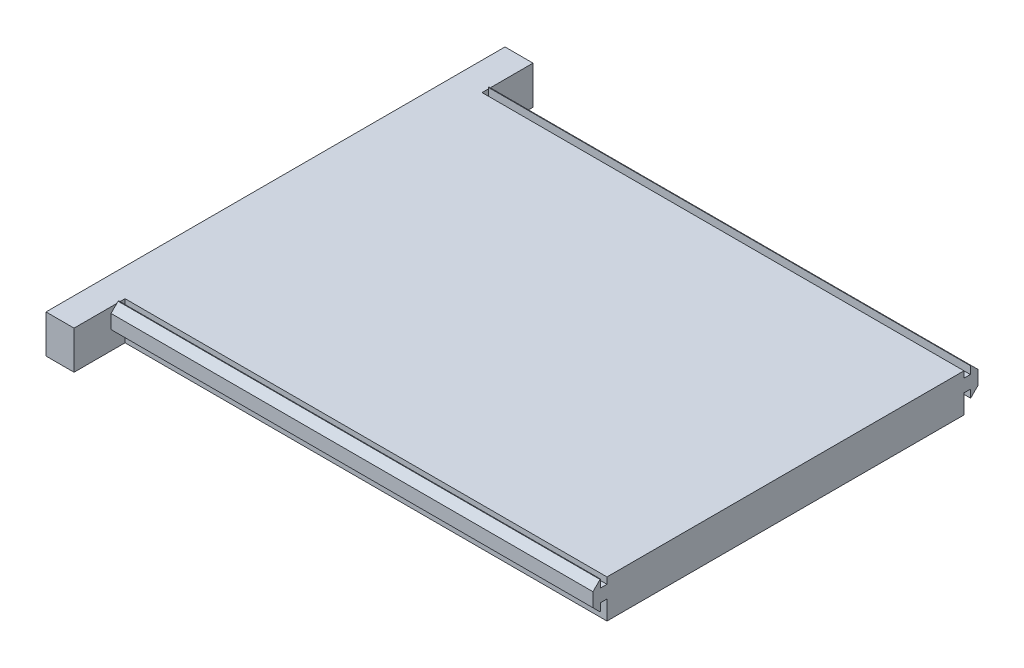
ISO-10303-21;
HEADER;
FILE_DESCRIPTION(('STEP AP214'),'2;1');
FILE_NAME('part.step','',(''),(''),'','','');
FILE_SCHEMA(('AUTOMOTIVE_DESIGN { 1 0 10303 214 1 1 1 1 }'));
ENDSEC;
DATA;
#1=APPLICATION_CONTEXT('core data for automotive mechanical design processes');
#2=APPLICATION_PROTOCOL_DEFINITION('international standard','automotive_design',2000,#1);
#3=PRODUCT_CONTEXT('',#1,'mechanical');
#4=PRODUCT('Part','Part','',(#3));
#5=PRODUCT_RELATED_PRODUCT_CATEGORY('part','',(#4));
#6=PRODUCT_DEFINITION_FORMATION('','',#4);
#7=PRODUCT_DEFINITION_CONTEXT('part definition',#1,'design');
#8=PRODUCT_DEFINITION('design','',#6,#7);
#9=PRODUCT_DEFINITION_SHAPE('','',#8);
#10=(LENGTH_UNIT() NAMED_UNIT(*) SI_UNIT(.MILLI.,.METRE.));
#11=(NAMED_UNIT(*) PLANE_ANGLE_UNIT() SI_UNIT($,.RADIAN.));
#12=(NAMED_UNIT(*) SI_UNIT($,.STERADIAN.) SOLID_ANGLE_UNIT());
#13=UNCERTAINTY_MEASURE_WITH_UNIT(LENGTH_MEASURE(1.E-05),#10,'distance_accuracy_value','');
#14=(GEOMETRIC_REPRESENTATION_CONTEXT(3) GLOBAL_UNCERTAINTY_ASSIGNED_CONTEXT((#13)) GLOBAL_UNIT_ASSIGNED_CONTEXT((#10,
#11,#12)) REPRESENTATION_CONTEXT('',''));
#15=CARTESIAN_POINT('',(0.,0.,0.));
#16=DIRECTION('',(0.,0.,1.));
#17=DIRECTION('',(1.,0.,0.));
#18=AXIS2_PLACEMENT_3D('',#15,#16,#17);
#19=CARTESIAN_POINT('',(265.,0.,0.));
#20=DIRECTION('',(1.,0.,0.));
#21=DIRECTION('',(0.,0.,-1.));
#22=AXIS2_PLACEMENT_3D('',#19,#20,#21);
#23=PLANE('',#22);
#24=DIRECTION('',(0.,0.,1.));
#25=VECTOR('',#24,1.);
#26=CARTESIAN_POINT('',(265.,2.5,0.));
#27=LINE('',#26,#25);
#28=CARTESIAN_POINT('',(265.,2.5,7.5));
#29=VERTEX_POINT('',#28);
#30=CARTESIAN_POINT('',(265.,2.5,10.));
#31=VERTEX_POINT('',#30);
#32=EDGE_CURVE('E267',#29,#31,#27,.T.);
#33=ORIENTED_EDGE('',*,*,#32,.T.);
#34=DIRECTION('',(0.,-1.,0.));
#35=VECTOR('',#34,1.);
#36=CARTESIAN_POINT('',(265.,0.,10.));
#37=LINE('',#36,#35);
#38=CARTESIAN_POINT('',(265.,5.,10.));
#39=VERTEX_POINT('',#38);
#40=EDGE_CURVE('E252',#39,#31,#37,.T.);
#41=ORIENTED_EDGE('',*,*,#40,.F.);
#42=DIRECTION('',(0.,0.,1.));
#43=VECTOR('',#42,1.);
#44=CARTESIAN_POINT('',(265.,5.,0.));
#45=LINE('',#44,#43);
#46=CARTESIAN_POINT('',(265.,5.,150.));
#47=VERTEX_POINT('',#46);
#48=EDGE_CURVE('E440',#39,#47,#45,.T.);
#49=ORIENTED_EDGE('',*,*,#48,.T.);
#50=DIRECTION('',(0.,-1.,0.));
#51=VECTOR('',#50,1.);
#52=CARTESIAN_POINT('',(265.,0.,150.));
#53=LINE('',#52,#51);
#54=CARTESIAN_POINT('',(265.,2.5,150.));
#55=VERTEX_POINT('',#54);
#56=EDGE_CURVE('E437',#47,#55,#53,.T.);
#57=ORIENTED_EDGE('',*,*,#56,.T.);
#58=DIRECTION('',(0.,0.,1.));
#59=VECTOR('',#58,1.);
#60=CARTESIAN_POINT('',(265.,2.5,0.));
#61=LINE('',#60,#59);
#62=CARTESIAN_POINT('',(265.,2.5,152.5));
#63=VERTEX_POINT('',#62);
#64=EDGE_CURVE('E360',#55,#63,#61,.T.);
#65=ORIENTED_EDGE('',*,*,#64,.T.);
#66=DIRECTION('',(0.,1.,0.));
#67=VECTOR('',#66,1.);
#68=CARTESIAN_POINT('',(265.,0.,152.5));
#69=LINE('',#68,#67);
#70=CARTESIAN_POINT('',(265.,5.5,152.5));
#71=VERTEX_POINT('',#70);
#72=EDGE_CURVE('E357',#63,#71,#69,.T.);
#73=ORIENTED_EDGE('',*,*,#72,.T.);
#74=DIRECTION('',(0.,0.,1.));
#75=VECTOR('',#74,1.);
#76=CARTESIAN_POINT('',(265.,5.5,0.));
#77=LINE('',#76,#75);
#78=CARTESIAN_POINT('',(265.,5.5,152.732233047034));
#79=VERTEX_POINT('',#78);
#80=EDGE_CURVE('E354',#71,#79,#77,.T.);
#81=ORIENTED_EDGE('',*,*,#80,.T.);
#82=DIRECTION('',(0.,-0.707106781186549,0.707106781186546));
#83=VECTOR('',#82,1.);
#84=CARTESIAN_POINT('',(265.,79.1161165235168,79.1161165235172));
#85=LINE('',#84,#83);
#86=CARTESIAN_POINT('',(265.,2.73223304703364,155.5));
#87=VERTEX_POINT('',#86);
#88=EDGE_CURVE('E351',#79,#87,#85,.T.);
#89=ORIENTED_EDGE('',*,*,#88,.T.);
#90=DIRECTION('',(0.,-1.,0.));
#91=VECTOR('',#90,1.);
#92=CARTESIAN_POINT('',(265.,0.,155.5));
#93=LINE('',#92,#91);
#94=CARTESIAN_POINT('',(265.,-2.73223304703372,155.5));
#95=VERTEX_POINT('',#94);
#96=EDGE_CURVE('E348',#87,#95,#93,.T.);
#97=ORIENTED_EDGE('',*,*,#96,.T.);
#98=DIRECTION('',(0.,-0.707106781186548,-0.707106781186547));
#99=VECTOR('',#98,1.);
#100=CARTESIAN_POINT('',(265.,-79.1161165235168,79.1161165235169));
#101=LINE('',#100,#99);
#102=CARTESIAN_POINT('',(265.,-5.49999999999996,152.732233047034));
#103=VERTEX_POINT('',#102);
#104=EDGE_CURVE('E345',#95,#103,#101,.T.);
#105=ORIENTED_EDGE('',*,*,#104,.T.);
#106=DIRECTION('',(0.,0.,-1.));
#107=VECTOR('',#106,1.);
#108=CARTESIAN_POINT('',(265.,-5.49999999999999,0.));
#109=LINE('',#108,#107);
#110=CARTESIAN_POINT('',(265.,-5.49999999999999,152.5));
#111=VERTEX_POINT('',#110);
#112=EDGE_CURVE('E342',#103,#111,#109,.T.);
#113=ORIENTED_EDGE('',*,*,#112,.T.);
#114=DIRECTION('',(0.,1.,0.));
#115=VECTOR('',#114,1.);
#116=CARTESIAN_POINT('',(265.,0.,152.5));
#117=LINE('',#116,#115);
#118=CARTESIAN_POINT('',(265.,-2.49999999999999,152.5));
#119=VERTEX_POINT('',#118);
#120=EDGE_CURVE('E339',#111,#119,#117,.T.);
#121=ORIENTED_EDGE('',*,*,#120,.T.);
#122=DIRECTION('',(0.,0.,-1.));
#123=VECTOR('',#122,1.);
#124=CARTESIAN_POINT('',(265.,-2.49999999999999,0.));
#125=LINE('',#124,#123);
#126=CARTESIAN_POINT('',(265.,-2.49999999999999,150.));
#127=VERTEX_POINT('',#126);
#128=EDGE_CURVE('E336',#119,#127,#125,.T.);
#129=ORIENTED_EDGE('',*,*,#128,.T.);
#130=CARTESIAN_POINT('',(265.,-10.,150.));
#131=VERTEX_POINT('',#130);
#132=EDGE_CURVE('E434',#127,#131,#53,.T.);
#133=ORIENTED_EDGE('',*,*,#132,.T.);
#134=DIRECTION('',(0.,0.,-1.));
#135=VECTOR('',#134,1.);
#136=CARTESIAN_POINT('',(265.,-10.,0.));
#137=LINE('',#136,#135);
#138=CARTESIAN_POINT('',(265.,-10.,10.));
#139=VERTEX_POINT('',#138);
#140=EDGE_CURVE('E248',#131,#139,#137,.T.);
#141=ORIENTED_EDGE('',*,*,#140,.T.);
#142=DIRECTION('',(0.,-1.,0.));
#143=VECTOR('',#142,1.);
#144=CARTESIAN_POINT('',(265.,0.,10.));
#145=LINE('',#144,#143);
#146=CARTESIAN_POINT('',(265.,-2.5,10.));
#147=VERTEX_POINT('',#146);
#148=EDGE_CURVE('E241',#147,#139,#145,.T.);
#149=ORIENTED_EDGE('',*,*,#148,.F.);
#150=DIRECTION('',(0.,0.,-1.));
#151=VECTOR('',#150,1.);
#152=CARTESIAN_POINT('',(265.,-2.5,0.));
#153=LINE('',#152,#151);
#154=CARTESIAN_POINT('',(265.,-2.5,7.49999999999999));
#155=VERTEX_POINT('',#154);
#156=EDGE_CURVE('E246',#147,#155,#153,.T.);
#157=ORIENTED_EDGE('',*,*,#156,.T.);
#158=DIRECTION('',(0.,-1.,0.));
#159=VECTOR('',#158,1.);
#160=CARTESIAN_POINT('',(265.,0.,7.49999999999999));
#161=LINE('',#160,#159);
#162=CARTESIAN_POINT('',(265.,-5.5,7.49999999999999));
#163=VERTEX_POINT('',#162);
#164=EDGE_CURVE('E261',#155,#163,#161,.T.);
#165=ORIENTED_EDGE('',*,*,#164,.T.);
#166=DIRECTION('',(0.,0.,-1.));
#167=VECTOR('',#166,1.);
#168=CARTESIAN_POINT('',(265.,-5.5,0.));
#169=LINE('',#168,#167);
#170=CARTESIAN_POINT('',(265.,-5.5,7.26776695296637));
#171=VERTEX_POINT('',#170);
#172=EDGE_CURVE('E293',#163,#171,#169,.T.);
#173=ORIENTED_EDGE('',*,*,#172,.T.);
#174=DIRECTION('',(0.,0.707106781186548,-0.707106781186548));
#175=VECTOR('',#174,1.);
#176=CARTESIAN_POINT('',(265.,0.883883476483188,0.883883476483188));
#177=LINE('',#176,#175);
#178=CARTESIAN_POINT('',(265.,-2.73223304703363,4.5));
#179=VERTEX_POINT('',#178);
#180=EDGE_CURVE('E290',#171,#179,#177,.T.);
#181=ORIENTED_EDGE('',*,*,#180,.T.);
#182=DIRECTION('',(0.,1.,0.));
#183=VECTOR('',#182,1.);
#184=CARTESIAN_POINT('',(265.,0.,4.5));
#185=LINE('',#184,#183);
#186=CARTESIAN_POINT('',(265.,2.73223304703363,4.5));
#187=VERTEX_POINT('',#186);
#188=EDGE_CURVE('E287',#179,#187,#185,.T.);
#189=ORIENTED_EDGE('',*,*,#188,.T.);
#190=DIRECTION('',(0.,0.707106781186548,0.707106781186548));
#191=VECTOR('',#190,1.);
#192=CARTESIAN_POINT('',(265.,-0.883883476483183,0.883883476483183));
#193=LINE('',#192,#191);
#194=CARTESIAN_POINT('',(265.,5.5,7.26776695296636));
#195=VERTEX_POINT('',#194);
#196=EDGE_CURVE('E284',#187,#195,#193,.T.);
#197=ORIENTED_EDGE('',*,*,#196,.T.);
#198=DIRECTION('',(0.,0.,1.));
#199=VECTOR('',#198,1.);
#200=CARTESIAN_POINT('',(265.,5.5,0.));
#201=LINE('',#200,#199);
#202=CARTESIAN_POINT('',(265.,5.5,7.5));
#203=VERTEX_POINT('',#202);
#204=EDGE_CURVE('E281',#195,#203,#201,.T.);
#205=ORIENTED_EDGE('',*,*,#204,.T.);
#206=DIRECTION('',(0.,-1.,0.));
#207=VECTOR('',#206,1.);
#208=CARTESIAN_POINT('',(265.,0.,7.5));
#209=LINE('',#208,#207);
#210=EDGE_CURVE('E270',#203,#29,#209,.T.);
#211=ORIENTED_EDGE('',*,*,#210,.T.);
#212=EDGE_LOOP('',(#33,#41,#49,#57,#65,#73,#81,#89,#97,#105,#113,#121,#129,#133,#141,#149,#157,
#165,#173,#181,#189,#197,#205,#211));
#213=FACE_BOUND('',#212,.T.);
#214=ADVANCED_FACE('F42',(#213),#23,.T.);
#215=CARTESIAN_POINT('',(76.,0.,0.));
#216=DIRECTION('',(-1.,0.,0.));
#217=DIRECTION('',(0.,0.,1.));
#218=AXIS2_PLACEMENT_3D('',#215,#216,#217);
#219=PLANE('',#218);
#220=DIRECTION('',(0.,0.,-1.));
#221=VECTOR('',#220,1.);
#222=CARTESIAN_POINT('',(76.,5.5,0.));
#223=LINE('',#222,#221);
#224=CARTESIAN_POINT('',(76.,5.5,7.5));
#225=VERTEX_POINT('',#224);
#226=CARTESIAN_POINT('',(76.,5.5,7.26776695296636));
#227=VERTEX_POINT('',#226);
#228=EDGE_CURVE('E532',#225,#227,#223,.T.);
#229=ORIENTED_EDGE('',*,*,#228,.T.);
#230=DIRECTION('',(0.,-0.707106781186548,-0.707106781186548));
#231=VECTOR('',#230,1.);
#232=CARTESIAN_POINT('',(76.,-0.883883476483183,0.883883476483183));
#233=LINE('',#232,#231);
#234=CARTESIAN_POINT('',(76.,5.,6.76776695296637));
#235=VERTEX_POINT('',#234);
#236=EDGE_CURVE('E538',#227,#235,#233,.T.);
#237=ORIENTED_EDGE('',*,*,#236,.T.);
#238=DIRECTION('',(0.,0.,1.));
#239=VECTOR('',#238,1.);
#240=CARTESIAN_POINT('',(76.,5.,7.9));
#241=LINE('',#240,#239);
#242=CARTESIAN_POINT('',(76.,5.,7.5));
#243=VERTEX_POINT('',#242);
#244=EDGE_CURVE('E391',#235,#243,#241,.T.);
#245=ORIENTED_EDGE('',*,*,#244,.T.);
#246=DIRECTION('',(0.,1.,0.));
#247=VECTOR('',#246,1.);
#248=CARTESIAN_POINT('',(76.,0.,7.5));
#249=LINE('',#248,#247);
#250=EDGE_CURVE('E11',#243,#225,#249,.T.);
#251=ORIENTED_EDGE('',*,*,#250,.T.);
#252=EDGE_LOOP('',(#229,#237,#245,#251));
#253=FACE_BOUND('',#252,.T.);
#254=ADVANCED_FACE('F568',(#253),#219,.T.);
#255=CARTESIAN_POINT('',(76.,0.,0.));
#256=DIRECTION('',(1.,0.,0.));
#257=DIRECTION('',(0.,0.,-1.));
#258=AXIS2_PLACEMENT_3D('',#255,#256,#257);
#259=PLANE('',#258);
#260=DIRECTION('',(0.,-0.707106781186549,0.707106781186546));
#261=VECTOR('',#260,1.);
#262=CARTESIAN_POINT('',(76.,79.1161165235168,79.1161165235172));
#263=LINE('',#262,#261);
#264=CARTESIAN_POINT('',(76.,5.49999999999998,152.732233047034));
#265=VERTEX_POINT('',#264);
#266=CARTESIAN_POINT('',(76.,5.,153.232233047034));
#267=VERTEX_POINT('',#266);
#268=EDGE_CURVE('E50',#265,#267,#263,.T.);
#269=ORIENTED_EDGE('',*,*,#268,.F.);
#270=DIRECTION('',(0.,0.,-1.));
#271=VECTOR('',#270,1.);
#272=CARTESIAN_POINT('',(76.,5.5,0.));
#273=LINE('',#272,#271);
#274=CARTESIAN_POINT('',(76.,5.5,152.5));
#275=VERTEX_POINT('',#274);
#276=EDGE_CURVE('E327',#265,#275,#273,.T.);
#277=ORIENTED_EDGE('',*,*,#276,.T.);
#278=DIRECTION('',(0.,-1.,0.));
#279=VECTOR('',#278,1.);
#280=CARTESIAN_POINT('',(76.,0.,152.5));
#281=LINE('',#280,#279);
#282=CARTESIAN_POINT('',(76.,5.,152.5));
#283=VERTEX_POINT('',#282);
#284=EDGE_CURVE('E331',#275,#283,#281,.T.);
#285=ORIENTED_EDGE('',*,*,#284,.T.);
#286=DIRECTION('',(0.,0.,1.));
#287=VECTOR('',#286,1.);
#288=CARTESIAN_POINT('',(76.,5.,152.1));
#289=LINE('',#288,#287);
#290=EDGE_CURVE('E387',#283,#267,#289,.T.);
#291=ORIENTED_EDGE('',*,*,#290,.T.);
#292=EDGE_LOOP('',(#269,#277,#285,#291));
#293=FACE_BOUND('',#292,.T.);
#294=ADVANCED_FACE('F466',(#293),#259,.F.);
#295=CARTESIAN_POINT('',(265.,0.,150.));
#296=DIRECTION('',(0.,0.,-1.));
#297=DIRECTION('',(-1.,0.,0.));
#298=AXIS2_PLACEMENT_3D('',#295,#296,#297);
#299=PLANE('',#298);
#300=DIRECTION('',(0.,-1.,0.));
#301=VECTOR('',#300,1.);
#302=CARTESIAN_POINT('',(76.,5.,150.));
#303=LINE('',#302,#301);
#304=CARTESIAN_POINT('',(76.,-2.49999999999999,150.));
#305=VERTEX_POINT('',#304);
#306=CARTESIAN_POINT('',(76.,-10.,150.));
#307=VERTEX_POINT('',#306);
#308=EDGE_CURVE('E417',#305,#307,#303,.T.);
#309=ORIENTED_EDGE('',*,*,#308,.T.);
#310=DIRECTION('',(-1.,0.,0.));
#311=VECTOR('',#310,1.);
#312=CARTESIAN_POINT('',(265.,-10.,150.));
#313=LINE('',#312,#311);
#314=EDGE_CURVE('E451',#131,#307,#313,.T.);
#315=ORIENTED_EDGE('',*,*,#314,.F.);
#316=ORIENTED_EDGE('',*,*,#132,.F.);
#317=DIRECTION('',(1.,0.,0.));
#318=VECTOR('',#317,1.);
#319=CARTESIAN_POINT('',(62.8071989327513,-2.49999999999999,150.));
#320=LINE('',#319,#318);
#321=EDGE_CURVE('E364',#305,#127,#320,.T.);
#322=ORIENTED_EDGE('',*,*,#321,.F.);
#323=EDGE_LOOP('',(#309,#315,#316,#322));
#324=FACE_BOUND('',#323,.T.);
#325=ADVANCED_FACE('F477',(#324),#299,.F.);
#326=CARTESIAN_POINT('',(76.,5.,150.));
#327=VERTEX_POINT('',#326);
#328=CARTESIAN_POINT('',(76.,2.5,150.));
#329=VERTEX_POINT('',#328);
#330=EDGE_CURVE('E414',#327,#329,#303,.T.);
#331=ORIENTED_EDGE('',*,*,#330,.T.);
#332=DIRECTION('',(1.,0.,0.));
#333=VECTOR('',#332,1.);
#334=CARTESIAN_POINT('',(62.8071989327513,2.5,150.));
#335=LINE('',#334,#333);
#336=EDGE_CURVE('E367',#329,#55,#335,.T.);
#337=ORIENTED_EDGE('',*,*,#336,.T.);
#338=ORIENTED_EDGE('',*,*,#56,.F.);
#339=DIRECTION('',(-1.,0.,0.));
#340=VECTOR('',#339,1.);
#341=CARTESIAN_POINT('',(265.,5.,150.));
#342=LINE('',#341,#340);
#343=EDGE_CURVE('E444',#47,#327,#342,.T.);
#344=ORIENTED_EDGE('',*,*,#343,.T.);
#345=EDGE_LOOP('',(#331,#337,#338,#344));
#346=FACE_BOUND('',#345,.T.);
#347=ADVANCED_FACE('F515',(#346),#299,.F.);
#348=CARTESIAN_POINT('',(265.,-10.,0.));
#349=DIRECTION('',(0.,1.,0.));
#350=DIRECTION('',(0.,0.,1.));
#351=AXIS2_PLACEMENT_3D('',#348,#349,#350);
#352=PLANE('',#351);
#353=DIRECTION('',(0.,0.,-1.));
#354=VECTOR('',#353,1.);
#355=CARTESIAN_POINT('',(65.,-10.,0.));
#356=LINE('',#355,#354);
#357=CARTESIAN_POINT('',(65.,-10.,170.));
#358=VERTEX_POINT('',#357);
#359=CARTESIAN_POINT('',(65.,-10.,-10.));
#360=VERTEX_POINT('',#359);
#361=EDGE_CURVE('E431',#358,#360,#356,.T.);
#362=ORIENTED_EDGE('',*,*,#361,.T.);
#363=DIRECTION('',(-1.,0.,0.));
#364=VECTOR('',#363,1.);
#365=CARTESIAN_POINT('',(76.,-10.,-10.));
#366=LINE('',#365,#364);
#367=CARTESIAN_POINT('',(76.,-10.,-10.));
#368=VERTEX_POINT('',#367);
#369=EDGE_CURVE('E390',#368,#360,#366,.T.);
#370=ORIENTED_EDGE('',*,*,#369,.F.);
#371=DIRECTION('',(0.,0.,1.));
#372=VECTOR('',#371,1.);
#373=CARTESIAN_POINT('',(76.,-10.,10.));
#374=LINE('',#373,#372);
#375=CARTESIAN_POINT('',(76.,-10.,10.));
#376=VERTEX_POINT('',#375);
#377=EDGE_CURVE('E397',#368,#376,#374,.T.);
#378=ORIENTED_EDGE('',*,*,#377,.T.);
#379=DIRECTION('',(-1.,0.,0.));
#380=VECTOR('',#379,1.);
#381=CARTESIAN_POINT('',(265.,-10.,10.));
#382=LINE('',#381,#380);
#383=EDGE_CURVE('E449',#139,#376,#382,.T.);
#384=ORIENTED_EDGE('',*,*,#383,.F.);
#385=ORIENTED_EDGE('',*,*,#140,.F.);
#386=ORIENTED_EDGE('',*,*,#314,.T.);
#387=DIRECTION('',(0.,0.,1.));
#388=VECTOR('',#387,1.);
#389=CARTESIAN_POINT('',(76.,-10.,150.));
#390=LINE('',#389,#388);
#391=CARTESIAN_POINT('',(76.,-10.,170.));
#392=VERTEX_POINT('',#391);
#393=EDGE_CURVE('E416',#307,#392,#390,.T.);
#394=ORIENTED_EDGE('',*,*,#393,.T.);
#395=DIRECTION('',(-1.,0.,0.));
#396=VECTOR('',#395,1.);
#397=CARTESIAN_POINT('',(76.,-10.,170.));
#398=LINE('',#397,#396);
#399=EDGE_CURVE('E425',#392,#358,#398,.T.);
#400=ORIENTED_EDGE('',*,*,#399,.T.);
#401=EDGE_LOOP('',(#362,#370,#378,#384,#385,#386,#394,#400));
#402=FACE_BOUND('',#401,.T.);
#403=ADVANCED_FACE('F44',(#402),#352,.F.);
#404=CARTESIAN_POINT('',(265.,0.,10.));
#405=DIRECTION('',(0.,0.,-1.));
#406=DIRECTION('',(-1.,0.,0.));
#407=AXIS2_PLACEMENT_3D('',#404,#405,#406);
#408=PLANE('',#407);
#409=DIRECTION('',(0.,1.,0.));
#410=VECTOR('',#409,1.);
#411=CARTESIAN_POINT('',(76.,5.,10.));
#412=LINE('',#411,#410);
#413=CARTESIAN_POINT('',(76.,-2.5,10.));
#414=VERTEX_POINT('',#413);
#415=EDGE_CURVE('E257',#376,#414,#412,.T.);
#416=ORIENTED_EDGE('',*,*,#415,.T.);
#417=DIRECTION('',(1.,0.,0.));
#418=VECTOR('',#417,1.);
#419=CARTESIAN_POINT('',(62.8071989327513,-2.5,10.));
#420=LINE('',#419,#418);
#421=EDGE_CURVE('E255',#414,#147,#420,.T.);
#422=ORIENTED_EDGE('',*,*,#421,.T.);
#423=ORIENTED_EDGE('',*,*,#148,.T.);
#424=ORIENTED_EDGE('',*,*,#383,.T.);
#425=EDGE_LOOP('',(#416,#422,#423,#424));
#426=FACE_BOUND('',#425,.T.);
#427=ADVANCED_FACE('F256',(#426),#408,.T.);
#428=CARTESIAN_POINT('',(265.,0.,10.));
#429=DIRECTION('',(0.,0.,-1.));
#430=DIRECTION('',(-1.,0.,0.));
#431=AXIS2_PLACEMENT_3D('',#428,#429,#430);
#432=PLANE('',#431);
#433=CARTESIAN_POINT('',(76.,2.5,10.));
#434=VERTEX_POINT('',#433);
#435=CARTESIAN_POINT('',(76.,5.,10.));
#436=VERTEX_POINT('',#435);
#437=EDGE_CURVE('E412',#434,#436,#412,.T.);
#438=ORIENTED_EDGE('',*,*,#437,.T.);
#439=DIRECTION('',(-1.,0.,0.));
#440=VECTOR('',#439,1.);
#441=CARTESIAN_POINT('',(265.,5.,10.));
#442=LINE('',#441,#440);
#443=EDGE_CURVE('E446',#39,#436,#442,.T.);
#444=ORIENTED_EDGE('',*,*,#443,.F.);
#445=ORIENTED_EDGE('',*,*,#40,.T.);
#446=DIRECTION('',(1.,0.,0.));
#447=VECTOR('',#446,1.);
#448=CARTESIAN_POINT('',(62.8071989327513,2.5,10.));
#449=LINE('',#448,#447);
#450=EDGE_CURVE('E260',#434,#31,#449,.T.);
#451=ORIENTED_EDGE('',*,*,#450,.F.);
#452=EDGE_LOOP('',(#438,#444,#445,#451));
#453=FACE_BOUND('',#452,.T.);
#454=ADVANCED_FACE('F522',(#453),#432,.T.);
#455=CARTESIAN_POINT('',(265.,5.,0.));
#456=DIRECTION('',(0.,-1.,0.));
#457=DIRECTION('',(0.,0.,-1.));
#458=AXIS2_PLACEMENT_3D('',#455,#456,#457);
#459=PLANE('',#458);
#460=DIRECTION('',(0.,0.,1.));
#461=VECTOR('',#460,1.);
#462=CARTESIAN_POINT('',(65.,5.,0.));
#463=LINE('',#462,#461);
#464=CARTESIAN_POINT('',(65.,5.,-10.));
#465=VERTEX_POINT('',#464);
#466=CARTESIAN_POINT('',(65.,5.,170.));
#467=VERTEX_POINT('',#466);
#468=EDGE_CURVE('E436',#465,#467,#463,.T.);
#469=ORIENTED_EDGE('',*,*,#468,.T.);
#470=DIRECTION('',(-1.,0.,0.));
#471=VECTOR('',#470,1.);
#472=CARTESIAN_POINT('',(76.,5.,170.));
#473=LINE('',#472,#471);
#474=CARTESIAN_POINT('',(76.,5.,170.));
#475=VERTEX_POINT('',#474);
#476=EDGE_CURVE('E428',#475,#467,#473,.T.);
#477=ORIENTED_EDGE('',*,*,#476,.F.);
#478=DIRECTION('',(0.,0.,-1.));
#479=VECTOR('',#478,1.);
#480=CARTESIAN_POINT('',(76.,5.,150.));
#481=LINE('',#480,#479);
#482=EDGE_CURVE('E423',#475,#267,#481,.T.);
#483=ORIENTED_EDGE('',*,*,#482,.T.);
#484=ORIENTED_EDGE('',*,*,#290,.F.);
#485=EDGE_CURVE('E65',#283,#327,#481,.T.);
#486=ORIENTED_EDGE('',*,*,#485,.T.);
#487=ORIENTED_EDGE('',*,*,#343,.F.);
#488=ORIENTED_EDGE('',*,*,#48,.F.);
#489=ORIENTED_EDGE('',*,*,#443,.T.);
#490=DIRECTION('',(0.,0.,-1.));
#491=VECTOR('',#490,1.);
#492=CARTESIAN_POINT('',(76.,5.,10.));
#493=LINE('',#492,#491);
#494=EDGE_CURVE('E410',#436,#243,#493,.T.);
#495=ORIENTED_EDGE('',*,*,#494,.T.);
#496=ORIENTED_EDGE('',*,*,#244,.F.);
#497=CARTESIAN_POINT('',(76.,5.,-10.));
#498=VERTEX_POINT('',#497);
#499=EDGE_CURVE('E409',#235,#498,#493,.T.);
#500=ORIENTED_EDGE('',*,*,#499,.T.);
#501=DIRECTION('',(-1.,0.,0.));
#502=VECTOR('',#501,1.);
#503=CARTESIAN_POINT('',(76.,5.,-10.));
#504=LINE('',#503,#502);
#505=EDGE_CURVE('E394',#498,#465,#504,.T.);
#506=ORIENTED_EDGE('',*,*,#505,.T.);
#507=EDGE_LOOP('',(#469,#477,#483,#484,#486,#487,#488,#489,#495,#496,#500,#506));
#508=FACE_BOUND('',#507,.T.);
#509=ADVANCED_FACE('F468',(#508),#459,.F.);
#510=CARTESIAN_POINT('',(65.,0.,0.));
#511=DIRECTION('',(1.,0.,0.));
#512=DIRECTION('',(0.,0.,-1.));
#513=AXIS2_PLACEMENT_3D('',#510,#511,#512);
#514=PLANE('',#513);
#515=DIRECTION('',(0.,1.,0.));
#516=VECTOR('',#515,1.);
#517=CARTESIAN_POINT('',(65.,5.,170.));
#518=LINE('',#517,#516);
#519=EDGE_CURVE('E403',#358,#467,#518,.T.);
#520=ORIENTED_EDGE('',*,*,#519,.T.);
#521=ORIENTED_EDGE('',*,*,#468,.F.);
#522=DIRECTION('',(0.,-1.,0.));
#523=VECTOR('',#522,1.);
#524=CARTESIAN_POINT('',(65.,5.,-10.));
#525=LINE('',#524,#523);
#526=EDGE_CURVE('E400',#465,#360,#525,.T.);
#527=ORIENTED_EDGE('',*,*,#526,.T.);
#528=ORIENTED_EDGE('',*,*,#361,.F.);
#529=EDGE_LOOP('',(#520,#521,#527,#528));
#530=FACE_BOUND('',#529,.T.);
#531=ADVANCED_FACE('F588',(#530),#514,.F.);
#532=CARTESIAN_POINT('',(76.,0.,0.));
#533=DIRECTION('',(-1.,0.,0.));
#534=DIRECTION('',(0.,0.,1.));
#535=AXIS2_PLACEMENT_3D('',#532,#533,#534);
#536=PLANE('',#535);
#537=DIRECTION('',(0.,0.,-1.));
#538=VECTOR('',#537,1.);
#539=CARTESIAN_POINT('',(76.,2.5,0.));
#540=LINE('',#539,#538);
#541=CARTESIAN_POINT('',(76.,2.5,152.5));
#542=VERTEX_POINT('',#541);
#543=EDGE_CURVE('E273',#542,#329,#540,.T.);
#544=ORIENTED_EDGE('',*,*,#543,.T.);
#545=ORIENTED_EDGE('',*,*,#330,.F.);
#546=ORIENTED_EDGE('',*,*,#485,.F.);
#547=EDGE_CURVE('E330',#283,#542,#281,.T.);
#548=ORIENTED_EDGE('',*,*,#547,.T.);
#549=EDGE_LOOP('',(#544,#545,#546,#548));
#550=FACE_BOUND('',#549,.T.);
#551=ADVANCED_FACE('F508',(#550),#536,.F.);
#552=DIRECTION('',(0.,0.707106781186549,-0.707106781186546));
#553=VECTOR('',#552,1.);
#554=CARTESIAN_POINT('',(76.,79.1161165235168,79.1161165235172));
#555=LINE('',#554,#553);
#556=CARTESIAN_POINT('',(76.,2.73223304703364,155.5));
#557=VERTEX_POINT('',#556);
#558=EDGE_CURVE('E324',#557,#267,#555,.T.);
#559=ORIENTED_EDGE('',*,*,#558,.T.);
#560=ORIENTED_EDGE('',*,*,#482,.F.);
#561=DIRECTION('',(0.,1.,0.));
#562=VECTOR('',#561,1.);
#563=CARTESIAN_POINT('',(76.,5.,170.));
#564=LINE('',#563,#562);
#565=EDGE_CURVE('E420',#392,#475,#564,.T.);
#566=ORIENTED_EDGE('',*,*,#565,.F.);
#567=ORIENTED_EDGE('',*,*,#393,.F.);
#568=ORIENTED_EDGE('',*,*,#308,.F.);
#569=DIRECTION('',(0.,0.,1.));
#570=VECTOR('',#569,1.);
#571=CARTESIAN_POINT('',(76.,-2.49999999999999,0.));
#572=LINE('',#571,#570);
#573=CARTESIAN_POINT('',(76.,-2.49999999999999,152.5));
#574=VERTEX_POINT('',#573);
#575=EDGE_CURVE('E268',#305,#574,#572,.T.);
#576=ORIENTED_EDGE('',*,*,#575,.T.);
#577=DIRECTION('',(0.,-1.,0.));
#578=VECTOR('',#577,1.);
#579=CARTESIAN_POINT('',(76.,0.,152.5));
#580=LINE('',#579,#578);
#581=CARTESIAN_POINT('',(76.,-5.49999999999999,152.5));
#582=VERTEX_POINT('',#581);
#583=EDGE_CURVE('E318',#574,#582,#580,.T.);
#584=ORIENTED_EDGE('',*,*,#583,.T.);
#585=DIRECTION('',(0.,0.,1.));
#586=VECTOR('',#585,1.);
#587=CARTESIAN_POINT('',(76.,-5.49999999999999,0.));
#588=LINE('',#587,#586);
#589=CARTESIAN_POINT('',(76.,-5.49999999999999,152.732233047034));
#590=VERTEX_POINT('',#589);
#591=EDGE_CURVE('E314',#582,#590,#588,.T.);
#592=ORIENTED_EDGE('',*,*,#591,.T.);
#593=DIRECTION('',(0.,0.707106781186548,0.707106781186547));
#594=VECTOR('',#593,1.);
#595=CARTESIAN_POINT('',(76.,-79.1161165235168,79.1161165235169));
#596=LINE('',#595,#594);
#597=CARTESIAN_POINT('',(76.,-2.73223304703372,155.5));
#598=VERTEX_POINT('',#597);
#599=EDGE_CURVE('E317',#590,#598,#596,.T.);
#600=ORIENTED_EDGE('',*,*,#599,.T.);
#601=DIRECTION('',(0.,1.,0.));
#602=VECTOR('',#601,1.);
#603=CARTESIAN_POINT('',(76.,0.,155.5));
#604=LINE('',#603,#602);
#605=EDGE_CURVE('E321',#598,#557,#604,.T.);
#606=ORIENTED_EDGE('',*,*,#605,.T.);
#607=EDGE_LOOP('',(#559,#560,#566,#567,#568,#576,#584,#592,#600,#606));
#608=FACE_BOUND('',#607,.T.);
#609=ADVANCED_FACE('F463',(#608),#536,.F.);
#610=CARTESIAN_POINT('',(76.,5.,170.));
#611=DIRECTION('',(0.,0.,1.));
#612=DIRECTION('',(1.,0.,0.));
#613=AXIS2_PLACEMENT_3D('',#610,#611,#612);
#614=PLANE('',#613);
#615=ORIENTED_EDGE('',*,*,#519,.F.);
#616=ORIENTED_EDGE('',*,*,#399,.F.);
#617=ORIENTED_EDGE('',*,*,#565,.T.);
#618=ORIENTED_EDGE('',*,*,#476,.T.);
#619=EDGE_LOOP('',(#615,#616,#617,#618));
#620=FACE_BOUND('',#619,.T.);
#621=ADVANCED_FACE('F472',(#620),#614,.T.);
#622=CARTESIAN_POINT('',(76.,5.,-10.));
#623=DIRECTION('',(0.,0.,-1.));
#624=DIRECTION('',(0.,1.,0.));
#625=AXIS2_PLACEMENT_3D('',#622,#623,#624);
#626=PLANE('',#625);
#627=ORIENTED_EDGE('',*,*,#526,.F.);
#628=ORIENTED_EDGE('',*,*,#505,.F.);
#629=DIRECTION('',(0.,-1.,0.));
#630=VECTOR('',#629,1.);
#631=CARTESIAN_POINT('',(76.,5.,-10.));
#632=LINE('',#631,#630);
#633=EDGE_CURVE('E406',#498,#368,#632,.T.);
#634=ORIENTED_EDGE('',*,*,#633,.T.);
#635=ORIENTED_EDGE('',*,*,#369,.T.);
#636=EDGE_LOOP('',(#627,#628,#634,#635));
#637=FACE_BOUND('',#636,.T.);
#638=ADVANCED_FACE('F558',(#637),#626,.T.);
#639=CARTESIAN_POINT('',(76.,0.,0.));
#640=DIRECTION('',(1.,0.,0.));
#641=DIRECTION('',(0.,0.,-1.));
#642=AXIS2_PLACEMENT_3D('',#639,#640,#641);
#643=PLANE('',#642);
#644=ORIENTED_EDGE('',*,*,#499,.F.);
#645=CARTESIAN_POINT('',(76.,2.73223304703363,4.5));
#646=VERTEX_POINT('',#645);
#647=EDGE_CURVE('E537',#235,#646,#233,.T.);
#648=ORIENTED_EDGE('',*,*,#647,.T.);
#649=DIRECTION('',(0.,-1.,0.));
#650=VECTOR('',#649,1.);
#651=CARTESIAN_POINT('',(76.,0.,4.5));
#652=LINE('',#651,#650);
#653=CARTESIAN_POINT('',(76.,-2.73223304703363,4.5));
#654=VERTEX_POINT('',#653);
#655=EDGE_CURVE('E541',#646,#654,#652,.T.);
#656=ORIENTED_EDGE('',*,*,#655,.T.);
#657=DIRECTION('',(0.,-0.707106781186548,0.707106781186548));
#658=VECTOR('',#657,1.);
#659=CARTESIAN_POINT('',(76.,0.883883476483188,0.883883476483188));
#660=LINE('',#659,#658);
#661=CARTESIAN_POINT('',(76.,-5.5,7.26776695296637));
#662=VERTEX_POINT('',#661);
#663=EDGE_CURVE('E544',#654,#662,#660,.T.);
#664=ORIENTED_EDGE('',*,*,#663,.T.);
#665=DIRECTION('',(0.,0.,1.));
#666=VECTOR('',#665,1.);
#667=CARTESIAN_POINT('',(76.,-5.5,0.));
#668=LINE('',#667,#666);
#669=CARTESIAN_POINT('',(76.,-5.5,7.49999999999999));
#670=VERTEX_POINT('',#669);
#671=EDGE_CURVE('E547',#662,#670,#668,.T.);
#672=ORIENTED_EDGE('',*,*,#671,.T.);
#673=DIRECTION('',(0.,1.,0.));
#674=VECTOR('',#673,1.);
#675=CARTESIAN_POINT('',(76.,0.,7.49999999999999));
#676=LINE('',#675,#674);
#677=CARTESIAN_POINT('',(76.,-2.5,7.49999999999999));
#678=VERTEX_POINT('',#677);
#679=EDGE_CURVE('E549',#670,#678,#676,.T.);
#680=ORIENTED_EDGE('',*,*,#679,.T.);
#681=DIRECTION('',(0.,0.,1.));
#682=VECTOR('',#681,1.);
#683=CARTESIAN_POINT('',(76.,-2.5,0.));
#684=LINE('',#683,#682);
#685=EDGE_CURVE('E276',#678,#414,#684,.T.);
#686=ORIENTED_EDGE('',*,*,#685,.T.);
#687=ORIENTED_EDGE('',*,*,#415,.F.);
#688=ORIENTED_EDGE('',*,*,#377,.F.);
#689=ORIENTED_EDGE('',*,*,#633,.F.);
#690=EDGE_LOOP('',(#644,#648,#656,#664,#672,#680,#686,#687,#688,#689));
#691=FACE_BOUND('',#690,.T.);
#692=ADVANCED_FACE('F552',(#691),#643,.T.);
#693=ORIENTED_EDGE('',*,*,#437,.F.);
#694=DIRECTION('',(0.,0.,-1.));
#695=VECTOR('',#694,1.);
#696=CARTESIAN_POINT('',(76.,2.5,0.));
#697=LINE('',#696,#695);
#698=CARTESIAN_POINT('',(76.,2.5,7.5));
#699=VERTEX_POINT('',#698);
#700=EDGE_CURVE('E298',#434,#699,#697,.T.);
#701=ORIENTED_EDGE('',*,*,#700,.T.);
#702=DIRECTION('',(0.,1.,0.));
#703=VECTOR('',#702,1.);
#704=CARTESIAN_POINT('',(76.,0.,7.5));
#705=LINE('',#704,#703);
#706=EDGE_CURVE('E530',#699,#243,#705,.T.);
#707=ORIENTED_EDGE('',*,*,#706,.T.);
#708=ORIENTED_EDGE('',*,*,#494,.F.);
#709=EDGE_LOOP('',(#693,#701,#707,#708));
#710=FACE_BOUND('',#709,.T.);
#711=ADVANCED_FACE('F570',(#710),#643,.T.);
#712=CARTESIAN_POINT('',(62.8071989327513,0.,152.5));
#713=DIRECTION('',(0.,0.,-1.));
#714=DIRECTION('',(-1.,0.,0.));
#715=AXIS2_PLACEMENT_3D('',#712,#713,#714);
#716=PLANE('',#715);
#717=DIRECTION('',(1.,0.,0.));
#718=VECTOR('',#717,1.);
#719=CARTESIAN_POINT('',(62.8071989327513,-2.49999999999999,152.5));
#720=LINE('',#719,#718);
#721=EDGE_CURVE('E363',#574,#119,#720,.T.);
#722=ORIENTED_EDGE('',*,*,#721,.T.);
#723=ORIENTED_EDGE('',*,*,#120,.F.);
#724=DIRECTION('',(1.,0.,0.));
#725=VECTOR('',#724,1.);
#726=CARTESIAN_POINT('',(62.8071989327513,-5.49999999999999,152.5));
#727=LINE('',#726,#725);
#728=EDGE_CURVE('E382',#582,#111,#727,.T.);
#729=ORIENTED_EDGE('',*,*,#728,.F.);
#730=ORIENTED_EDGE('',*,*,#583,.F.);
#731=EDGE_LOOP('',(#722,#723,#729,#730));
#732=FACE_BOUND('',#731,.T.);
#733=ADVANCED_FACE('F486',(#732),#716,.T.);
#734=CARTESIAN_POINT('',(62.8071989327513,-5.49999999999999,0.));
#735=DIRECTION('',(0.,-1.,0.));
#736=DIRECTION('',(0.,0.,-1.));
#737=AXIS2_PLACEMENT_3D('',#734,#735,#736);
#738=PLANE('',#737);
#739=ORIENTED_EDGE('',*,*,#728,.T.);
#740=ORIENTED_EDGE('',*,*,#112,.F.);
#741=DIRECTION('',(1.,0.,0.));
#742=VECTOR('',#741,1.);
#743=CARTESIAN_POINT('',(62.8071989327513,-5.49999999999996,152.732233047034));
#744=LINE('',#743,#742);
#745=EDGE_CURVE('E380',#590,#103,#744,.T.);
#746=ORIENTED_EDGE('',*,*,#745,.F.);
#747=ORIENTED_EDGE('',*,*,#591,.F.);
#748=EDGE_LOOP('',(#739,#740,#746,#747));
#749=FACE_BOUND('',#748,.T.);
#750=ADVANCED_FACE('F490',(#749),#738,.T.);
#751=CARTESIAN_POINT('',(62.8071989327513,-79.1161165235168,79.1161165235169));
#752=DIRECTION('',(0.,-0.707106781186547,0.707106781186548));
#753=DIRECTION('',(0.,-0.707106781186548,-0.707106781186547));
#754=AXIS2_PLACEMENT_3D('',#751,#752,#753);
#755=PLANE('',#754);
#756=ORIENTED_EDGE('',*,*,#745,.T.);
#757=ORIENTED_EDGE('',*,*,#104,.F.);
#758=DIRECTION('',(1.,0.,0.));
#759=VECTOR('',#758,1.);
#760=CARTESIAN_POINT('',(62.8071989327513,-2.73223304703372,155.5));
#761=LINE('',#760,#759);
#762=EDGE_CURVE('E378',#598,#95,#761,.T.);
#763=ORIENTED_EDGE('',*,*,#762,.F.);
#764=ORIENTED_EDGE('',*,*,#599,.F.);
#765=EDGE_LOOP('',(#756,#757,#763,#764));
#766=FACE_BOUND('',#765,.T.);
#767=ADVANCED_FACE('F494',(#766),#755,.T.);
#768=CARTESIAN_POINT('',(62.8071989327513,0.,155.5));
#769=DIRECTION('',(0.,0.,1.));
#770=DIRECTION('',(1.,0.,0.));
#771=AXIS2_PLACEMENT_3D('',#768,#769,#770);
#772=PLANE('',#771);
#773=ORIENTED_EDGE('',*,*,#762,.T.);
#774=ORIENTED_EDGE('',*,*,#96,.F.);
#775=DIRECTION('',(1.,0.,0.));
#776=VECTOR('',#775,1.);
#777=CARTESIAN_POINT('',(62.8071989327513,2.73223304703364,155.5));
#778=LINE('',#777,#776);
#779=EDGE_CURVE('E376',#557,#87,#778,.T.);
#780=ORIENTED_EDGE('',*,*,#779,.F.);
#781=ORIENTED_EDGE('',*,*,#605,.F.);
#782=EDGE_LOOP('',(#773,#774,#780,#781));
#783=FACE_BOUND('',#782,.T.);
#784=ADVANCED_FACE('F498',(#783),#772,.T.);
#785=CARTESIAN_POINT('',(62.8071989327513,79.1161165235168,79.1161165235172));
#786=DIRECTION('',(0.,0.707106781186546,0.707106781186549));
#787=DIRECTION('',(0.,-0.707106781186549,0.707106781186546));
#788=AXIS2_PLACEMENT_3D('',#785,#786,#787);
#789=PLANE('',#788);
#790=ORIENTED_EDGE('',*,*,#779,.T.);
#791=ORIENTED_EDGE('',*,*,#88,.F.);
#792=DIRECTION('',(1.,0.,0.));
#793=VECTOR('',#792,1.);
#794=CARTESIAN_POINT('',(62.8071989327513,5.5,152.732233047034));
#795=LINE('',#794,#793);
#796=EDGE_CURVE('E374',#265,#79,#795,.T.);
#797=ORIENTED_EDGE('',*,*,#796,.F.);
#798=ORIENTED_EDGE('',*,*,#268,.T.);
#799=ORIENTED_EDGE('',*,*,#558,.F.);
#800=EDGE_LOOP('',(#790,#791,#797,#798,#799));
#801=FACE_BOUND('',#800,.T.);
#802=ADVANCED_FACE('F457',(#801),#789,.T.);
#803=CARTESIAN_POINT('',(62.8071989327513,5.5,0.));
#804=DIRECTION('',(0.,1.,0.));
#805=DIRECTION('',(0.,0.,1.));
#806=AXIS2_PLACEMENT_3D('',#803,#804,#805);
#807=PLANE('',#806);
#808=ORIENTED_EDGE('',*,*,#796,.T.);
#809=ORIENTED_EDGE('',*,*,#80,.F.);
#810=DIRECTION('',(1.,0.,0.));
#811=VECTOR('',#810,1.);
#812=CARTESIAN_POINT('',(62.8071989327513,5.5,152.5));
#813=LINE('',#812,#811);
#814=EDGE_CURVE('E372',#275,#71,#813,.T.);
#815=ORIENTED_EDGE('',*,*,#814,.F.);
#816=ORIENTED_EDGE('',*,*,#276,.F.);
#817=EDGE_LOOP('',(#808,#809,#815,#816));
#818=FACE_BOUND('',#817,.T.);
#819=ADVANCED_FACE('F503',(#818),#807,.T.);
#820=CARTESIAN_POINT('',(62.8071989327513,0.,152.5));
#821=DIRECTION('',(0.,0.,-1.));
#822=DIRECTION('',(-1.,0.,0.));
#823=AXIS2_PLACEMENT_3D('',#820,#821,#822);
#824=PLANE('',#823);
#825=ORIENTED_EDGE('',*,*,#814,.T.);
#826=ORIENTED_EDGE('',*,*,#72,.F.);
#827=DIRECTION('',(1.,0.,0.));
#828=VECTOR('',#827,1.);
#829=CARTESIAN_POINT('',(62.8071989327513,2.5,152.5));
#830=LINE('',#829,#828);
#831=EDGE_CURVE('E370',#542,#63,#830,.T.);
#832=ORIENTED_EDGE('',*,*,#831,.F.);
#833=ORIENTED_EDGE('',*,*,#547,.F.);
#834=ORIENTED_EDGE('',*,*,#284,.F.);
#835=EDGE_LOOP('',(#825,#826,#832,#833,#834));
#836=FACE_BOUND('',#835,.T.);
#837=ADVANCED_FACE('F505',(#836),#824,.T.);
#838=CARTESIAN_POINT('',(62.8071989327513,2.5,0.));
#839=DIRECTION('',(0.,1.,0.));
#840=DIRECTION('',(0.,0.,1.));
#841=AXIS2_PLACEMENT_3D('',#838,#839,#840);
#842=PLANE('',#841);
#843=ORIENTED_EDGE('',*,*,#831,.T.);
#844=ORIENTED_EDGE('',*,*,#64,.F.);
#845=ORIENTED_EDGE('',*,*,#336,.F.);
#846=ORIENTED_EDGE('',*,*,#543,.F.);
#847=EDGE_LOOP('',(#843,#844,#845,#846));
#848=FACE_BOUND('',#847,.T.);
#849=ADVANCED_FACE('F511',(#848),#842,.T.);
#850=CARTESIAN_POINT('',(62.8071989327513,-2.49999999999999,0.));
#851=DIRECTION('',(0.,-1.,0.));
#852=DIRECTION('',(0.,0.,-1.));
#853=AXIS2_PLACEMENT_3D('',#850,#851,#852);
#854=PLANE('',#853);
#855=ORIENTED_EDGE('',*,*,#321,.T.);
#856=ORIENTED_EDGE('',*,*,#128,.F.);
#857=ORIENTED_EDGE('',*,*,#721,.F.);
#858=ORIENTED_EDGE('',*,*,#575,.F.);
#859=EDGE_LOOP('',(#855,#856,#857,#858));
#860=FACE_BOUND('',#859,.T.);
#861=ADVANCED_FACE('F482',(#860),#854,.T.);
#862=CARTESIAN_POINT('',(62.8071989327513,-2.5,0.));
#863=DIRECTION('',(0.,-1.,0.));
#864=DIRECTION('',(0.,0.,-1.));
#865=AXIS2_PLACEMENT_3D('',#862,#863,#864);
#866=PLANE('',#865);
#867=DIRECTION('',(1.,0.,0.));
#868=VECTOR('',#867,1.);
#869=CARTESIAN_POINT('',(62.8071989327513,-2.5,7.49999999999999));
#870=LINE('',#869,#868);
#871=EDGE_CURVE('E265',#678,#155,#870,.T.);
#872=ORIENTED_EDGE('',*,*,#871,.T.);
#873=ORIENTED_EDGE('',*,*,#156,.F.);
#874=ORIENTED_EDGE('',*,*,#421,.F.);
#875=ORIENTED_EDGE('',*,*,#685,.F.);
#876=EDGE_LOOP('',(#872,#873,#874,#875));
#877=FACE_BOUND('',#876,.T.);
#878=ADVANCED_FACE('F263',(#877),#866,.T.);
#879=CARTESIAN_POINT('',(62.8071989327513,0.,7.49999999999999));
#880=DIRECTION('',(0.,0.,1.));
#881=DIRECTION('',(1.,0.,0.));
#882=AXIS2_PLACEMENT_3D('',#879,#880,#881);
#883=PLANE('',#882);
#884=DIRECTION('',(1.,0.,0.));
#885=VECTOR('',#884,1.);
#886=CARTESIAN_POINT('',(62.8071989327513,-5.5,7.49999999999999));
#887=LINE('',#886,#885);
#888=EDGE_CURVE('E299',#670,#163,#887,.T.);
#889=ORIENTED_EDGE('',*,*,#888,.T.);
#890=ORIENTED_EDGE('',*,*,#164,.F.);
#891=ORIENTED_EDGE('',*,*,#871,.F.);
#892=ORIENTED_EDGE('',*,*,#679,.F.);
#893=EDGE_LOOP('',(#889,#890,#891,#892));
#894=FACE_BOUND('',#893,.T.);
#895=ADVANCED_FACE('F782',(#894),#883,.T.);
#896=CARTESIAN_POINT('',(62.8071989327513,-5.5,0.));
#897=DIRECTION('',(0.,-1.,0.));
#898=DIRECTION('',(0.,0.,-1.));
#899=AXIS2_PLACEMENT_3D('',#896,#897,#898);
#900=PLANE('',#899);
#901=DIRECTION('',(1.,0.,0.));
#902=VECTOR('',#901,1.);
#903=CARTESIAN_POINT('',(62.8071989327513,-5.5,7.26776695296637));
#904=LINE('',#903,#902);
#905=EDGE_CURVE('E301',#662,#171,#904,.T.);
#906=ORIENTED_EDGE('',*,*,#905,.T.);
#907=ORIENTED_EDGE('',*,*,#172,.F.);
#908=ORIENTED_EDGE('',*,*,#888,.F.);
#909=ORIENTED_EDGE('',*,*,#671,.F.);
#910=EDGE_LOOP('',(#906,#907,#908,#909));
#911=FACE_BOUND('',#910,.T.);
#912=ADVANCED_FACE('F791',(#911),#900,.T.);
#913=CARTESIAN_POINT('',(62.8071989327513,0.883883476483188,0.883883476483188));
#914=DIRECTION('',(0.,-0.707106781186548,-0.707106781186548));
#915=DIRECTION('',(0.,0.707106781186548,-0.707106781186548));
#916=AXIS2_PLACEMENT_3D('',#913,#914,#915);
#917=PLANE('',#916);
#918=DIRECTION('',(1.,0.,0.));
#919=VECTOR('',#918,1.);
#920=CARTESIAN_POINT('',(62.8071989327513,-2.73223304703363,4.5));
#921=LINE('',#920,#919);
#922=EDGE_CURVE('E303',#654,#179,#921,.T.);
#923=ORIENTED_EDGE('',*,*,#922,.T.);
#924=ORIENTED_EDGE('',*,*,#180,.F.);
#925=ORIENTED_EDGE('',*,*,#905,.F.);
#926=ORIENTED_EDGE('',*,*,#663,.F.);
#927=EDGE_LOOP('',(#923,#924,#925,#926));
#928=FACE_BOUND('',#927,.T.);
#929=ADVANCED_FACE('F801',(#928),#917,.T.);
#930=CARTESIAN_POINT('',(62.8071989327513,0.,4.5));
#931=DIRECTION('',(0.,0.,-1.));
#932=DIRECTION('',(-1.,0.,0.));
#933=AXIS2_PLACEMENT_3D('',#930,#931,#932);
#934=PLANE('',#933);
#935=DIRECTION('',(1.,0.,0.));
#936=VECTOR('',#935,1.);
#937=CARTESIAN_POINT('',(62.8071989327513,2.73223304703363,4.5));
#938=LINE('',#937,#936);
#939=EDGE_CURVE('E305',#646,#187,#938,.T.);
#940=ORIENTED_EDGE('',*,*,#939,.T.);
#941=ORIENTED_EDGE('',*,*,#188,.F.);
#942=ORIENTED_EDGE('',*,*,#922,.F.);
#943=ORIENTED_EDGE('',*,*,#655,.F.);
#944=EDGE_LOOP('',(#940,#941,#942,#943));
#945=FACE_BOUND('',#944,.T.);
#946=ADVANCED_FACE('F811',(#945),#934,.T.);
#947=CARTESIAN_POINT('',(62.8071989327513,-0.883883476483183,0.883883476483183));
#948=DIRECTION('',(0.,0.707106781186548,-0.707106781186548));
#949=DIRECTION('',(0.,0.707106781186548,0.707106781186548));
#950=AXIS2_PLACEMENT_3D('',#947,#948,#949);
#951=PLANE('',#950);
#952=DIRECTION('',(1.,0.,0.));
#953=VECTOR('',#952,1.);
#954=CARTESIAN_POINT('',(62.8071989327513,5.5,7.26776695296636));
#955=LINE('',#954,#953);
#956=EDGE_CURVE('E307',#227,#195,#955,.T.);
#957=ORIENTED_EDGE('',*,*,#956,.T.);
#958=ORIENTED_EDGE('',*,*,#196,.F.);
#959=ORIENTED_EDGE('',*,*,#939,.F.);
#960=ORIENTED_EDGE('',*,*,#647,.F.);
#961=ORIENTED_EDGE('',*,*,#236,.F.);
#962=EDGE_LOOP('',(#957,#958,#959,#960,#961));
#963=FACE_BOUND('',#962,.T.);
#964=ADVANCED_FACE('F564',(#963),#951,.T.);
#965=CARTESIAN_POINT('',(62.8071989327513,5.5,0.));
#966=DIRECTION('',(0.,1.,0.));
#967=DIRECTION('',(0.,0.,1.));
#968=AXIS2_PLACEMENT_3D('',#965,#966,#967);
#969=PLANE('',#968);
#970=DIRECTION('',(1.,0.,0.));
#971=VECTOR('',#970,1.);
#972=CARTESIAN_POINT('',(62.8071989327513,5.5,7.5));
#973=LINE('',#972,#971);
#974=EDGE_CURVE('E57',#225,#203,#973,.T.);
#975=ORIENTED_EDGE('',*,*,#974,.T.);
#976=ORIENTED_EDGE('',*,*,#204,.F.);
#977=ORIENTED_EDGE('',*,*,#956,.F.);
#978=ORIENTED_EDGE('',*,*,#228,.F.);
#979=EDGE_LOOP('',(#975,#976,#977,#978));
#980=FACE_BOUND('',#979,.T.);
#981=ADVANCED_FACE('F830',(#980),#969,.T.);
#982=CARTESIAN_POINT('',(62.8071989327513,0.,7.5));
#983=DIRECTION('',(0.,0.,1.));
#984=DIRECTION('',(1.,0.,0.));
#985=AXIS2_PLACEMENT_3D('',#982,#983,#984);
#986=PLANE('',#985);
#987=DIRECTION('',(1.,0.,0.));
#988=VECTOR('',#987,1.);
#989=CARTESIAN_POINT('',(62.8071989327513,2.5,7.5));
#990=LINE('',#989,#988);
#991=EDGE_CURVE('E310',#699,#29,#990,.T.);
#992=ORIENTED_EDGE('',*,*,#991,.T.);
#993=ORIENTED_EDGE('',*,*,#210,.F.);
#994=ORIENTED_EDGE('',*,*,#974,.F.);
#995=ORIENTED_EDGE('',*,*,#250,.F.);
#996=ORIENTED_EDGE('',*,*,#706,.F.);
#997=EDGE_LOOP('',(#992,#993,#994,#995,#996));
#998=FACE_BOUND('',#997,.T.);
#999=ADVANCED_FACE('F569',(#998),#986,.T.);
#1000=CARTESIAN_POINT('',(62.8071989327513,2.5,0.));
#1001=DIRECTION('',(0.,1.,0.));
#1002=DIRECTION('',(0.,0.,1.));
#1003=AXIS2_PLACEMENT_3D('',#1000,#1001,#1002);
#1004=PLANE('',#1003);
#1005=ORIENTED_EDGE('',*,*,#450,.T.);
#1006=ORIENTED_EDGE('',*,*,#32,.F.);
#1007=ORIENTED_EDGE('',*,*,#991,.F.);
#1008=ORIENTED_EDGE('',*,*,#700,.F.);
#1009=EDGE_LOOP('',(#1005,#1006,#1007,#1008));
#1010=FACE_BOUND('',#1009,.T.);
#1011=ADVANCED_FACE('F525',(#1010),#1004,.T.);
#1012=CLOSED_SHELL('',(#214,#254,#294,#325,#347,#403,#427,#454,#509,#531,#551,#609,#621,#638,
#692,#711,#733,#750,#767,#784,#802,#819,#837,#849,#861,#878,#895,#912,#929,#946,#964,#981,#999,#1011));
#1013=MANIFOLD_SOLID_BREP('B2',#1012);
#1014=ADVANCED_BREP_SHAPE_REPRESENTATION('',(#18,#1013),#14);
#1015=SHAPE_DEFINITION_REPRESENTATION(#9,#1014);
ENDSEC;
END-ISO-10303-21;
